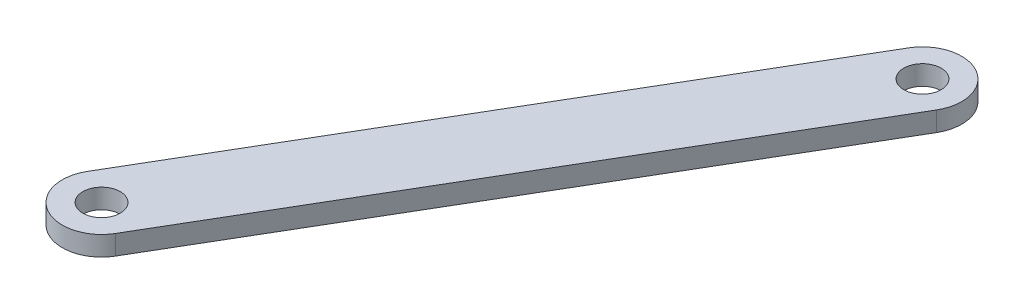
ISO-10303-21;
HEADER;
FILE_DESCRIPTION(('STEP AP214'),'2;1');
FILE_NAME('part.step','',(''),(''),'','','');
FILE_SCHEMA(('AUTOMOTIVE_DESIGN { 1 0 10303 214 1 1 1 1 }'));
ENDSEC;
DATA;
#1=APPLICATION_CONTEXT('core data for automotive mechanical design processes');
#2=APPLICATION_PROTOCOL_DEFINITION('international standard','automotive_design',2000,#1);
#3=PRODUCT_CONTEXT('',#1,'mechanical');
#4=PRODUCT('Part','Part','',(#3));
#5=PRODUCT_RELATED_PRODUCT_CATEGORY('part','',(#4));
#6=PRODUCT_DEFINITION_FORMATION('','',#4);
#7=PRODUCT_DEFINITION_CONTEXT('part definition',#1,'design');
#8=PRODUCT_DEFINITION('design','',#6,#7);
#9=PRODUCT_DEFINITION_SHAPE('','',#8);
#10=(LENGTH_UNIT() NAMED_UNIT(*) SI_UNIT(.MILLI.,.METRE.));
#11=(NAMED_UNIT(*) PLANE_ANGLE_UNIT() SI_UNIT($,.RADIAN.));
#12=(NAMED_UNIT(*) SI_UNIT($,.STERADIAN.) SOLID_ANGLE_UNIT());
#13=UNCERTAINTY_MEASURE_WITH_UNIT(LENGTH_MEASURE(1.E-05),#10,'distance_accuracy_value','');
#14=(GEOMETRIC_REPRESENTATION_CONTEXT(3) GLOBAL_UNCERTAINTY_ASSIGNED_CONTEXT((#13)) GLOBAL_UNIT_ASSIGNED_CONTEXT((#10,
#11,#12)) REPRESENTATION_CONTEXT('',''));
#15=CARTESIAN_POINT('',(0.,0.,0.));
#16=DIRECTION('',(0.,0.,1.));
#17=DIRECTION('',(1.,0.,0.));
#18=AXIS2_PLACEMENT_3D('',#15,#16,#17);
#19=CARTESIAN_POINT('',(2.74409304317788,15.,-395.26651908374));
#20=DIRECTION('',(0.,-1.,0.));
#21=DIRECTION('',(0.,0.,-1.));
#22=AXIS2_PLACEMENT_3D('',#19,#20,#21);
#23=CYLINDRICAL_SURFACE('',#22,29.9999999999999);
#24=CARTESIAN_POINT('',(2.74409304317788,0.,-395.26651908374));
#25=DIRECTION('',(0.,1.,0.));
#26=DIRECTION('',(0.,0.,1.));
#27=AXIS2_PLACEMENT_3D('',#24,#25,#26);
#28=CIRCLE('',#27,29.9999999999999);
#29=CARTESIAN_POINT('',(28.6202858799555,0.,-380.086840421993));
#30=VERTEX_POINT('',#29);
#31=CARTESIAN_POINT('',(-23.1320997935998,0.,-410.446197745487));
#32=VERTEX_POINT('',#31);
#33=EDGE_CURVE('E107',#30,#32,#28,.T.);
#34=ORIENTED_EDGE('',*,*,#33,.T.);
#35=DIRECTION('',(0.,-1.,0.));
#36=VECTOR('',#35,1.);
#37=CARTESIAN_POINT('',(-23.1320997935998,15.,-410.446197745487));
#38=LINE('',#37,#36);
#39=CARTESIAN_POINT('',(-23.1320997935998,15.,-410.446197745487));
#40=VERTEX_POINT('',#39);
#41=EDGE_CURVE('E11',#40,#32,#38,.T.);
#42=ORIENTED_EDGE('',*,*,#41,.F.);
#43=CARTESIAN_POINT('',(2.74409304317788,15.,-395.26651908374));
#44=DIRECTION('',(0.,1.,0.));
#45=DIRECTION('',(0.,0.,1.));
#46=AXIS2_PLACEMENT_3D('',#43,#44,#45);
#47=CIRCLE('',#46,29.9999999999999);
#48=CARTESIAN_POINT('',(28.6202858799555,15.,-380.086840421993));
#49=VERTEX_POINT('',#48);
#50=EDGE_CURVE('E91',#49,#40,#47,.T.);
#51=ORIENTED_EDGE('',*,*,#50,.F.);
#52=DIRECTION('',(0.,-1.,0.));
#53=VECTOR('',#52,1.);
#54=CARTESIAN_POINT('',(28.6202858799555,15.,-380.086840421993));
#55=LINE('',#54,#53);
#56=EDGE_CURVE('E103',#49,#30,#55,.T.);
#57=ORIENTED_EDGE('',*,*,#56,.T.);
#58=EDGE_LOOP('',(#34,#42,#51,#57));
#59=FACE_BOUND('',#58,.T.);
#60=ADVANCED_FACE('F39',(#59),#23,.T.);
#61=CARTESIAN_POINT('',(-23.1320997935998,15.,-410.446197745487));
#62=DIRECTION('',(0.862539761225924,0.,0.505989288724895));
#63=DIRECTION('',(0.505989288724895,0.,-0.862539761225924));
#64=AXIS2_PLACEMENT_3D('',#61,#62,#63);
#65=PLANE('',#64);
#66=DIRECTION('',(-0.505989288724895,0.,0.862539761225924));
#67=VECTOR('',#66,1.);
#68=CARTESIAN_POINT('',(-23.1320997935998,0.,-410.446197745487));
#69=LINE('',#68,#67);
#70=CARTESIAN_POINT('',(-255.006192836779,0.,-15.1796786617572));
#71=VERTEX_POINT('',#70);
#72=EDGE_CURVE('E96',#32,#71,#69,.T.);
#73=ORIENTED_EDGE('',*,*,#72,.T.);
#74=DIRECTION('',(0.,-1.,0.));
#75=VECTOR('',#74,1.);
#76=CARTESIAN_POINT('',(-255.006192836779,15.,-15.1796786617572));
#77=LINE('',#76,#75);
#78=CARTESIAN_POINT('',(-255.006192836779,15.,-15.1796786617572));
#79=VERTEX_POINT('',#78);
#80=EDGE_CURVE('E48',#79,#71,#77,.T.);
#81=ORIENTED_EDGE('',*,*,#80,.F.);
#82=DIRECTION('',(-0.505989288724895,0.,0.862539761225924));
#83=VECTOR('',#82,1.);
#84=CARTESIAN_POINT('',(-23.1320997935998,15.,-410.446197745487));
#85=LINE('',#84,#83);
#86=EDGE_CURVE('E86',#40,#79,#85,.T.);
#87=ORIENTED_EDGE('',*,*,#86,.F.);
#88=ORIENTED_EDGE('',*,*,#41,.T.);
#89=EDGE_LOOP('',(#73,#81,#87,#88));
#90=FACE_BOUND('',#89,.T.);
#91=ADVANCED_FACE('F95',(#90),#65,.F.);
#92=CARTESIAN_POINT('',(-229.130000000002,15.,-1.0315369633621E-11));
#93=DIRECTION('',(0.,-1.,0.));
#94=DIRECTION('',(0.,0.,-1.));
#95=AXIS2_PLACEMENT_3D('',#92,#93,#94);
#96=CYLINDRICAL_SURFACE('',#95,30.);
#97=CARTESIAN_POINT('',(-229.130000000002,0.,-1.0315369633621E-11));
#98=DIRECTION('',(0.,1.,0.));
#99=DIRECTION('',(0.,0.,1.));
#100=AXIS2_PLACEMENT_3D('',#97,#98,#99);
#101=CIRCLE('',#100,30.);
#102=CARTESIAN_POINT('',(-203.253807163224,0.,15.1796786617365));
#103=VERTEX_POINT('',#102);
#104=EDGE_CURVE('E73',#71,#103,#101,.T.);
#105=ORIENTED_EDGE('',*,*,#104,.T.);
#106=DIRECTION('',(0.,-1.,0.));
#107=VECTOR('',#106,1.);
#108=CARTESIAN_POINT('',(-203.253807163224,15.,15.1796786617365));
#109=LINE('',#108,#107);
#110=CARTESIAN_POINT('',(-203.253807163224,15.,15.1796786617365));
#111=VERTEX_POINT('',#110);
#112=EDGE_CURVE('E98',#111,#103,#109,.T.);
#113=ORIENTED_EDGE('',*,*,#112,.F.);
#114=CARTESIAN_POINT('',(-229.130000000002,15.,-1.0315369633621E-11));
#115=DIRECTION('',(0.,1.,0.));
#116=DIRECTION('',(0.,0.,1.));
#117=AXIS2_PLACEMENT_3D('',#114,#115,#116);
#118=CIRCLE('',#117,30.);
#119=EDGE_CURVE('E89',#79,#111,#118,.T.);
#120=ORIENTED_EDGE('',*,*,#119,.F.);
#121=ORIENTED_EDGE('',*,*,#80,.T.);
#122=EDGE_LOOP('',(#105,#113,#120,#121));
#123=FACE_BOUND('',#122,.T.);
#124=ADVANCED_FACE('F99',(#123),#96,.T.);
#125=CARTESIAN_POINT('',(28.6202858799555,15.,-380.086840421993));
#126=DIRECTION('',(-0.862539761225924,0.,-0.505989288724895));
#127=DIRECTION('',(-0.505989288724895,0.,0.862539761225924));
#128=AXIS2_PLACEMENT_3D('',#125,#126,#127);
#129=PLANE('',#128);
#130=DIRECTION('',(0.505989288724895,0.,-0.862539761225924));
#131=VECTOR('',#130,1.);
#132=CARTESIAN_POINT('',(28.6202858799555,0.,-380.086840421993));
#133=LINE('',#132,#131);
#134=EDGE_CURVE('E79',#103,#30,#133,.T.);
#135=ORIENTED_EDGE('',*,*,#134,.T.);
#136=ORIENTED_EDGE('',*,*,#56,.F.);
#137=DIRECTION('',(0.505989288724895,0.,-0.862539761225924));
#138=VECTOR('',#137,1.);
#139=CARTESIAN_POINT('',(28.6202858799555,15.,-380.086840421993));
#140=LINE('',#139,#138);
#141=EDGE_CURVE('E56',#111,#49,#140,.T.);
#142=ORIENTED_EDGE('',*,*,#141,.F.);
#143=ORIENTED_EDGE('',*,*,#112,.T.);
#144=EDGE_LOOP('',(#135,#136,#142,#143));
#145=FACE_BOUND('',#144,.T.);
#146=ADVANCED_FACE('F121',(#145),#129,.F.);
#147=CARTESIAN_POINT('',(2.74409304317788,15.,-395.26651908374));
#148=DIRECTION('',(0.,1.,0.));
#149=DIRECTION('',(0.,0.,1.));
#150=AXIS2_PLACEMENT_3D('',#147,#148,#149);
#151=PLANE('',#150);
#152=CARTESIAN_POINT('',(-229.130000000002,15.,-1.0315369633621E-11));
#153=DIRECTION('',(0.,1.,0.));
#154=DIRECTION('',(0.,0.,1.));
#155=AXIS2_PLACEMENT_3D('',#152,#153,#154);
#156=CIRCLE('',#155,14.2899999999983);
#157=CARTESIAN_POINT('',(-229.130000000002,15.,14.289999999988));
#158=VERTEX_POINT('',#157);
#159=EDGE_CURVE('E136',#158,#158,#156,.T.);
#160=ORIENTED_EDGE('',*,*,#159,.F.);
#161=EDGE_LOOP('',(#160));
#162=FACE_BOUND('',#161,.T.);
#163=CARTESIAN_POINT('',(2.74409304317788,15.,-395.26651908374));
#164=DIRECTION('',(0.,1.,0.));
#165=DIRECTION('',(0.,0.,1.));
#166=AXIS2_PLACEMENT_3D('',#163,#164,#165);
#167=CIRCLE('',#166,14.2900000000354);
#168=CARTESIAN_POINT('',(2.74409304317788,15.,-380.976519083705));
#169=VERTEX_POINT('',#168);
#170=EDGE_CURVE('E128',#169,#169,#167,.T.);
#171=ORIENTED_EDGE('',*,*,#170,.F.);
#172=EDGE_LOOP('',(#171));
#173=FACE_BOUND('',#172,.T.);
#174=ORIENTED_EDGE('',*,*,#50,.T.);
#175=ORIENTED_EDGE('',*,*,#86,.T.);
#176=ORIENTED_EDGE('',*,*,#119,.T.);
#177=ORIENTED_EDGE('',*,*,#141,.T.);
#178=EDGE_LOOP('',(#174,#175,#176,#177));
#179=FACE_BOUND('',#178,.T.);
#180=ADVANCED_FACE('F87',(#162,#173,#179),#151,.T.);
#181=CARTESIAN_POINT('',(2.74409304317788,0.,-395.26651908374));
#182=DIRECTION('',(0.,1.,0.));
#183=DIRECTION('',(0.,0.,1.));
#184=AXIS2_PLACEMENT_3D('',#181,#182,#183);
#185=PLANE('',#184);
#186=CARTESIAN_POINT('',(-229.130000000002,0.,-1.0315369633621E-11));
#187=DIRECTION('',(0.,1.,0.));
#188=DIRECTION('',(0.,0.,1.));
#189=AXIS2_PLACEMENT_3D('',#186,#187,#188);
#190=CIRCLE('',#189,14.2899999999983);
#191=CARTESIAN_POINT('',(-229.130000000002,0.,14.289999999988));
#192=VERTEX_POINT('',#191);
#193=EDGE_CURVE('E111',#192,#192,#190,.T.);
#194=ORIENTED_EDGE('',*,*,#193,.T.);
#195=EDGE_LOOP('',(#194));
#196=FACE_BOUND('',#195,.T.);
#197=CARTESIAN_POINT('',(2.74409304317788,0.,-395.26651908374));
#198=DIRECTION('',(0.,1.,0.));
#199=DIRECTION('',(0.,0.,1.));
#200=AXIS2_PLACEMENT_3D('',#197,#198,#199);
#201=CIRCLE('',#200,14.2900000000354);
#202=CARTESIAN_POINT('',(2.74409304317788,0.,-380.976519083705));
#203=VERTEX_POINT('',#202);
#204=EDGE_CURVE('E132',#203,#203,#201,.T.);
#205=ORIENTED_EDGE('',*,*,#204,.T.);
#206=EDGE_LOOP('',(#205));
#207=FACE_BOUND('',#206,.T.);
#208=ORIENTED_EDGE('',*,*,#33,.F.);
#209=ORIENTED_EDGE('',*,*,#134,.F.);
#210=ORIENTED_EDGE('',*,*,#104,.F.);
#211=ORIENTED_EDGE('',*,*,#72,.F.);
#212=EDGE_LOOP('',(#208,#209,#210,#211));
#213=FACE_BOUND('',#212,.T.);
#214=ADVANCED_FACE('F124',(#196,#207,#213),#185,.F.);
#215=CARTESIAN_POINT('',(2.74409304317788,0.,-395.26651908374));
#216=DIRECTION('',(0.,1.,0.));
#217=DIRECTION('',(0.,0.,1.));
#218=AXIS2_PLACEMENT_3D('',#215,#216,#217);
#219=CYLINDRICAL_SURFACE('',#218,14.2900000000354);
#220=ORIENTED_EDGE('',*,*,#204,.F.);
#221=EDGE_LOOP('',(#220));
#222=FACE_BOUND('',#221,.T.);
#223=ORIENTED_EDGE('',*,*,#170,.T.);
#224=EDGE_LOOP('',(#223));
#225=FACE_BOUND('',#224,.T.);
#226=ADVANCED_FACE('F149',(#222,#225),#219,.F.);
#227=CARTESIAN_POINT('',(-229.130000000002,0.,-1.0315369633621E-11));
#228=DIRECTION('',(0.,1.,0.));
#229=DIRECTION('',(0.,0.,1.));
#230=AXIS2_PLACEMENT_3D('',#227,#228,#229);
#231=CYLINDRICAL_SURFACE('',#230,14.2899999999983);
#232=ORIENTED_EDGE('',*,*,#193,.F.);
#233=EDGE_LOOP('',(#232));
#234=FACE_BOUND('',#233,.T.);
#235=ORIENTED_EDGE('',*,*,#159,.T.);
#236=EDGE_LOOP('',(#235));
#237=FACE_BOUND('',#236,.T.);
#238=ADVANCED_FACE('F146',(#234,#237),#231,.F.);
#239=CLOSED_SHELL('',(#60,#91,#124,#146,#180,#214,#226,#238));
#240=MANIFOLD_SOLID_BREP('B2',#239);
#241=ADVANCED_BREP_SHAPE_REPRESENTATION('',(#18,#240),#14);
#242=SHAPE_DEFINITION_REPRESENTATION(#9,#241);
ENDSEC;
END-ISO-10303-21;
